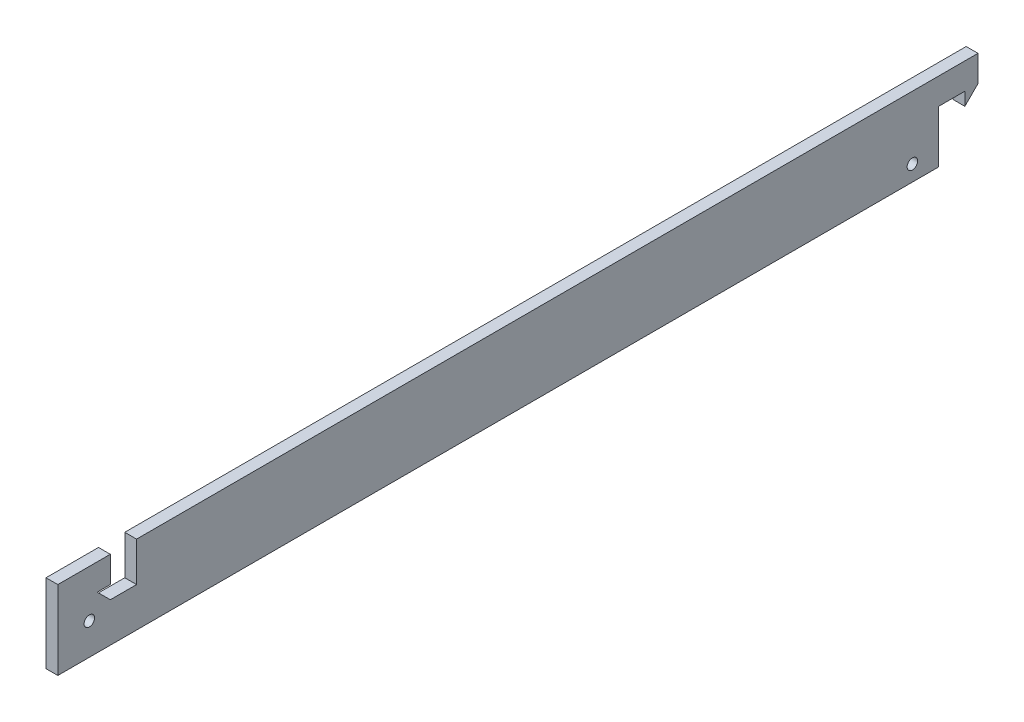
ISO-10303-21;
HEADER;
FILE_DESCRIPTION(('STEP AP214'),'2;1');
FILE_NAME('part.step','',(''),(''),'','','');
FILE_SCHEMA(('AUTOMOTIVE_DESIGN { 1 0 10303 214 1 1 1 1 }'));
ENDSEC;
DATA;
#1=APPLICATION_CONTEXT('core data for automotive mechanical design processes');
#2=APPLICATION_PROTOCOL_DEFINITION('international standard','automotive_design',2000,#1);
#3=PRODUCT_CONTEXT('',#1,'mechanical');
#4=PRODUCT('Part','Part','',(#3));
#5=PRODUCT_RELATED_PRODUCT_CATEGORY('part','',(#4));
#6=PRODUCT_DEFINITION_FORMATION('','',#4);
#7=PRODUCT_DEFINITION_CONTEXT('part definition',#1,'design');
#8=PRODUCT_DEFINITION('design','',#6,#7);
#9=PRODUCT_DEFINITION_SHAPE('','',#8);
#10=(LENGTH_UNIT() NAMED_UNIT(*) SI_UNIT(.MILLI.,.METRE.));
#11=(NAMED_UNIT(*) PLANE_ANGLE_UNIT() SI_UNIT($,.RADIAN.));
#12=(NAMED_UNIT(*) SI_UNIT($,.STERADIAN.) SOLID_ANGLE_UNIT());
#13=UNCERTAINTY_MEASURE_WITH_UNIT(LENGTH_MEASURE(1.E-05),#10,'distance_accuracy_value','');
#14=(GEOMETRIC_REPRESENTATION_CONTEXT(3) GLOBAL_UNCERTAINTY_ASSIGNED_CONTEXT((#13)) GLOBAL_UNIT_ASSIGNED_CONTEXT((#10,
#11,#12)) REPRESENTATION_CONTEXT('',''));
#15=CARTESIAN_POINT('',(0.,0.,0.));
#16=DIRECTION('',(0.,0.,1.));
#17=DIRECTION('',(1.,0.,0.));
#18=AXIS2_PLACEMENT_3D('',#15,#16,#17);
#19=CARTESIAN_POINT('',(4.5,0.,0.));
#20=DIRECTION('',(-1.,0.,0.));
#21=DIRECTION('',(0.,0.,1.));
#22=AXIS2_PLACEMENT_3D('',#19,#20,#21);
#23=PLANE('',#22);
#24=DIRECTION('',(0.,-1.,0.));
#25=VECTOR('',#24,1.);
#26=CARTESIAN_POINT('',(4.5,15.,30.8460387102848));
#27=LINE('',#26,#25);
#28=CARTESIAN_POINT('',(4.5,15.,30.8460387102848));
#29=VERTEX_POINT('',#28);
#30=CARTESIAN_POINT('',(4.5,0.,30.8460387102848));
#31=VERTEX_POINT('',#30);
#32=EDGE_CURVE('E199',#29,#31,#27,.T.);
#33=ORIENTED_EDGE('',*,*,#32,.T.);
#34=DIRECTION('',(0.,0.,1.));
#35=VECTOR('',#34,1.);
#36=CARTESIAN_POINT('',(4.5,0.,30.8460387102848));
#37=LINE('',#36,#35);
#38=CARTESIAN_POINT('',(4.5,0.,40.8460387102848));
#39=VERTEX_POINT('',#38);
#40=EDGE_CURVE('E113',#31,#39,#37,.T.);
#41=ORIENTED_EDGE('',*,*,#40,.T.);
#42=DIRECTION('',(0.,0.707106781186547,0.707106781186548));
#43=VECTOR('',#42,1.);
#44=CARTESIAN_POINT('',(4.5,0.,40.8460387102848));
#45=LINE('',#44,#43);
#46=CARTESIAN_POINT('',(4.5,5.,45.8460387102848));
#47=VERTEX_POINT('',#46);
#48=EDGE_CURVE('E232',#39,#47,#45,.T.);
#49=ORIENTED_EDGE('',*,*,#48,.T.);
#50=DIRECTION('',(0.,0.,-1.));
#51=VECTOR('',#50,1.);
#52=CARTESIAN_POINT('',(4.5,5.,45.8460387102848));
#53=LINE('',#52,#51);
#54=CARTESIAN_POINT('',(4.5,5.,40.8460387102848));
#55=VERTEX_POINT('',#54);
#56=EDGE_CURVE('E249',#47,#55,#53,.T.);
#57=ORIENTED_EDGE('',*,*,#56,.T.);
#58=DIRECTION('',(0.,1.,0.));
#59=VECTOR('',#58,1.);
#60=CARTESIAN_POINT('',(4.5,5.,40.8460387102848));
#61=LINE('',#60,#59);
#62=CARTESIAN_POINT('',(4.5,15.,40.8460387102848));
#63=VERTEX_POINT('',#62);
#64=EDGE_CURVE('E246',#55,#63,#61,.T.);
#65=ORIENTED_EDGE('',*,*,#64,.T.);
#66=DIRECTION('',(0.,0.,1.));
#67=VECTOR('',#66,1.);
#68=CARTESIAN_POINT('',(4.5,15.,40.8460387102848));
#69=LINE('',#68,#67);
#70=CARTESIAN_POINT('',(4.5,15.,60.8460387102848));
#71=VERTEX_POINT('',#70);
#72=EDGE_CURVE('E248',#63,#71,#69,.T.);
#73=ORIENTED_EDGE('',*,*,#72,.T.);
#74=DIRECTION('',(0.,-1.,0.));
#75=VECTOR('',#74,1.);
#76=CARTESIAN_POINT('',(4.5,15.,60.8460387102848));
#77=LINE('',#76,#75);
#78=CARTESIAN_POINT('',(4.5,-15.,60.8460387102848));
#79=VERTEX_POINT('',#78);
#80=EDGE_CURVE('E251',#71,#79,#77,.T.);
#81=ORIENTED_EDGE('',*,*,#80,.T.);
#82=DIRECTION('',(0.,0.,-1.));
#83=VECTOR('',#82,1.);
#84=CARTESIAN_POINT('',(4.5,-15.,60.8460387102848));
#85=LINE('',#84,#83);
#86=CARTESIAN_POINT('',(4.5,-15.,-274.653961289715));
#87=VERTEX_POINT('',#86);
#88=EDGE_CURVE('E257',#79,#87,#85,.T.);
#89=ORIENTED_EDGE('',*,*,#88,.T.);
#90=DIRECTION('',(0.,1.,0.));
#91=VECTOR('',#90,1.);
#92=CARTESIAN_POINT('',(4.5,-15.,-274.653961289715));
#93=LINE('',#92,#91);
#94=CARTESIAN_POINT('',(4.5,5.00000000000004,-274.653961289715));
#95=VERTEX_POINT('',#94);
#96=EDGE_CURVE('E259',#87,#95,#93,.T.);
#97=ORIENTED_EDGE('',*,*,#96,.T.);
#98=DIRECTION('',(0.,0.,-1.));
#99=VECTOR('',#98,1.);
#100=CARTESIAN_POINT('',(4.5,5.00000000000004,-274.653961289715));
#101=LINE('',#100,#99);
#102=CARTESIAN_POINT('',(4.5,5.00000000000004,-284.653961289715));
#103=VERTEX_POINT('',#102);
#104=EDGE_CURVE('E261',#95,#103,#101,.T.);
#105=ORIENTED_EDGE('',*,*,#104,.T.);
#106=DIRECTION('',(0.,-1.,0.));
#107=VECTOR('',#106,1.);
#108=CARTESIAN_POINT('',(4.5,5.00000000000004,-284.653961289715));
#109=LINE('',#108,#107);
#110=CARTESIAN_POINT('',(4.5,0.,-284.653961289715));
#111=VERTEX_POINT('',#110);
#112=EDGE_CURVE('E151',#103,#111,#109,.T.);
#113=ORIENTED_EDGE('',*,*,#112,.T.);
#114=DIRECTION('',(0.,0.707106781186547,-0.707106781186548));
#115=VECTOR('',#114,1.);
#116=CARTESIAN_POINT('',(4.5,0.,-284.653961289715));
#117=LINE('',#116,#115);
#118=CARTESIAN_POINT('',(4.5,5.00000000000004,-289.653961289715));
#119=VERTEX_POINT('',#118);
#120=EDGE_CURVE('E144',#111,#119,#117,.T.);
#121=ORIENTED_EDGE('',*,*,#120,.T.);
#122=DIRECTION('',(0.,1.,0.));
#123=VECTOR('',#122,1.);
#124=CARTESIAN_POINT('',(4.5,5.00000000000004,-289.653961289715));
#125=LINE('',#124,#123);
#126=CARTESIAN_POINT('',(4.5,15.,-289.653961289715));
#127=VERTEX_POINT('',#126);
#128=EDGE_CURVE('E148',#119,#127,#125,.T.);
#129=ORIENTED_EDGE('',*,*,#128,.T.);
#130=DIRECTION('',(0.,0.,1.));
#131=VECTOR('',#130,1.);
#132=CARTESIAN_POINT('',(4.5,15.,-289.653961289715));
#133=LINE('',#132,#131);
#134=EDGE_CURVE('E54',#127,#29,#133,.T.);
#135=ORIENTED_EDGE('',*,*,#134,.T.);
#136=EDGE_LOOP('',(#33,#41,#49,#57,#65,#73,#81,#89,#97,#105,#113,#121,#129,#135));
#137=FACE_BOUND('',#136,.T.);
#138=CARTESIAN_POINT('',(4.5,-3.00000000000003,48.8460387102848));
#139=DIRECTION('',(1.,0.,0.));
#140=DIRECTION('',(0.,0.,-1.));
#141=AXIS2_PLACEMENT_3D('',#138,#139,#140);
#142=CIRCLE('',#141,2.);
#143=CARTESIAN_POINT('',(4.5,-3.00000000000003,46.8460387102848));
#144=VERTEX_POINT('',#143);
#145=EDGE_CURVE('E175',#144,#144,#142,.T.);
#146=ORIENTED_EDGE('',*,*,#145,.F.);
#147=EDGE_LOOP('',(#146));
#148=FACE_BOUND('',#147,.T.);
#149=CARTESIAN_POINT('',(4.5,-9.00000000000037,-264.653961289715));
#150=DIRECTION('',(1.,0.,0.));
#151=DIRECTION('',(0.,0.,-1.));
#152=AXIS2_PLACEMENT_3D('',#149,#150,#151);
#153=CIRCLE('',#152,2.00000000019509);
#154=CARTESIAN_POINT('',(4.5,-9.00000000000037,-266.65396128991));
#155=VERTEX_POINT('',#154);
#156=EDGE_CURVE('E282',#155,#155,#153,.T.);
#157=ORIENTED_EDGE('',*,*,#156,.F.);
#158=EDGE_LOOP('',(#157));
#159=FACE_BOUND('',#158,.T.);
#160=ADVANCED_FACE('F37',(#137,#148,#159),#23,.F.);
#161=CARTESIAN_POINT('',(0.,0.,0.));
#162=DIRECTION('',(-1.,0.,0.));
#163=DIRECTION('',(0.,0.,1.));
#164=AXIS2_PLACEMENT_3D('',#161,#162,#163);
#165=PLANE('',#164);
#166=CARTESIAN_POINT('',(0.,-3.00000000000003,48.8460387102848));
#167=DIRECTION('',(1.,0.,0.));
#168=DIRECTION('',(0.,0.,-1.));
#169=AXIS2_PLACEMENT_3D('',#166,#167,#168);
#170=CIRCLE('',#169,2.);
#171=CARTESIAN_POINT('',(0.,-3.00000000000003,46.8460387102848));
#172=VERTEX_POINT('',#171);
#173=EDGE_CURVE('E279',#172,#172,#170,.T.);
#174=ORIENTED_EDGE('',*,*,#173,.T.);
#175=EDGE_LOOP('',(#174));
#176=FACE_BOUND('',#175,.T.);
#177=DIRECTION('',(0.,-1.,0.));
#178=VECTOR('',#177,1.);
#179=CARTESIAN_POINT('',(0.,15.,30.8460387102848));
#180=LINE('',#179,#178);
#181=CARTESIAN_POINT('',(0.,15.,30.8460387102848));
#182=VERTEX_POINT('',#181);
#183=CARTESIAN_POINT('',(0.,0.,30.8460387102848));
#184=VERTEX_POINT('',#183);
#185=EDGE_CURVE('E171',#182,#184,#180,.T.);
#186=ORIENTED_EDGE('',*,*,#185,.F.);
#187=DIRECTION('',(0.,0.,1.));
#188=VECTOR('',#187,1.);
#189=CARTESIAN_POINT('',(0.,15.,-274.653961289715));
#190=LINE('',#189,#188);
#191=CARTESIAN_POINT('',(0.,15.,-289.653961289715));
#192=VERTEX_POINT('',#191);
#193=EDGE_CURVE('E101',#192,#182,#190,.T.);
#194=ORIENTED_EDGE('',*,*,#193,.F.);
#195=DIRECTION('',(0.,1.,0.));
#196=VECTOR('',#195,1.);
#197=CARTESIAN_POINT('',(0.,5.00000000000004,-289.653961289715));
#198=LINE('',#197,#196);
#199=CARTESIAN_POINT('',(0.,5.00000000000004,-289.653961289715));
#200=VERTEX_POINT('',#199);
#201=EDGE_CURVE('E196',#200,#192,#198,.T.);
#202=ORIENTED_EDGE('',*,*,#201,.F.);
#203=DIRECTION('',(0.,0.707106781186547,-0.707106781186548));
#204=VECTOR('',#203,1.);
#205=CARTESIAN_POINT('',(0.,0.,-284.653961289715));
#206=LINE('',#205,#204);
#207=CARTESIAN_POINT('',(0.,0.,-284.653961289715));
#208=VERTEX_POINT('',#207);
#209=EDGE_CURVE('E160',#208,#200,#206,.T.);
#210=ORIENTED_EDGE('',*,*,#209,.F.);
#211=DIRECTION('',(0.,-1.,0.));
#212=VECTOR('',#211,1.);
#213=CARTESIAN_POINT('',(0.,5.00000000000004,-284.653961289715));
#214=LINE('',#213,#212);
#215=CARTESIAN_POINT('',(0.,5.00000000000004,-284.653961289715));
#216=VERTEX_POINT('',#215);
#217=EDGE_CURVE('E193',#216,#208,#214,.T.);
#218=ORIENTED_EDGE('',*,*,#217,.F.);
#219=DIRECTION('',(0.,0.,-1.));
#220=VECTOR('',#219,1.);
#221=CARTESIAN_POINT('',(0.,5.00000000000004,-274.653961289715));
#222=LINE('',#221,#220);
#223=CARTESIAN_POINT('',(0.,5.00000000000004,-274.653961289715));
#224=VERTEX_POINT('',#223);
#225=EDGE_CURVE('E191',#224,#216,#222,.T.);
#226=ORIENTED_EDGE('',*,*,#225,.F.);
#227=DIRECTION('',(0.,1.,0.));
#228=VECTOR('',#227,1.);
#229=CARTESIAN_POINT('',(0.,-15.,-274.653961289715));
#230=LINE('',#229,#228);
#231=CARTESIAN_POINT('',(0.,-15.,-274.653961289715));
#232=VERTEX_POINT('',#231);
#233=EDGE_CURVE('E189',#232,#224,#230,.T.);
#234=ORIENTED_EDGE('',*,*,#233,.F.);
#235=DIRECTION('',(0.,0.,-1.));
#236=VECTOR('',#235,1.);
#237=CARTESIAN_POINT('',(0.,-15.,60.8460387102848));
#238=LINE('',#237,#236);
#239=CARTESIAN_POINT('',(0.,-15.,60.8460387102848));
#240=VERTEX_POINT('',#239);
#241=EDGE_CURVE('E187',#240,#232,#238,.T.);
#242=ORIENTED_EDGE('',*,*,#241,.F.);
#243=DIRECTION('',(0.,-1.,0.));
#244=VECTOR('',#243,1.);
#245=CARTESIAN_POINT('',(0.,15.,60.8460387102848));
#246=LINE('',#245,#244);
#247=CARTESIAN_POINT('',(0.,15.,60.8460387102848));
#248=VERTEX_POINT('',#247);
#249=EDGE_CURVE('E185',#248,#240,#246,.T.);
#250=ORIENTED_EDGE('',*,*,#249,.F.);
#251=DIRECTION('',(0.,0.,1.));
#252=VECTOR('',#251,1.);
#253=CARTESIAN_POINT('',(0.,15.,40.8460387102848));
#254=LINE('',#253,#252);
#255=CARTESIAN_POINT('',(0.,15.,40.8460387102848));
#256=VERTEX_POINT('',#255);
#257=EDGE_CURVE('E183',#256,#248,#254,.T.);
#258=ORIENTED_EDGE('',*,*,#257,.F.);
#259=DIRECTION('',(0.,1.,0.));
#260=VECTOR('',#259,1.);
#261=CARTESIAN_POINT('',(0.,5.,40.8460387102848));
#262=LINE('',#261,#260);
#263=CARTESIAN_POINT('',(0.,5.,40.8460387102848));
#264=VERTEX_POINT('',#263);
#265=EDGE_CURVE('E181',#264,#256,#262,.T.);
#266=ORIENTED_EDGE('',*,*,#265,.F.);
#267=DIRECTION('',(0.,0.,-1.));
#268=VECTOR('',#267,1.);
#269=CARTESIAN_POINT('',(0.,5.,45.8460387102848));
#270=LINE('',#269,#268);
#271=CARTESIAN_POINT('',(0.,5.,45.8460387102848));
#272=VERTEX_POINT('',#271);
#273=EDGE_CURVE('E179',#272,#264,#270,.T.);
#274=ORIENTED_EDGE('',*,*,#273,.F.);
#275=DIRECTION('',(0.,0.707106781186547,0.707106781186548));
#276=VECTOR('',#275,1.);
#277=CARTESIAN_POINT('',(0.,0.,40.8460387102848));
#278=LINE('',#277,#276);
#279=CARTESIAN_POINT('',(0.,0.,40.8460387102848));
#280=VERTEX_POINT('',#279);
#281=EDGE_CURVE('E177',#280,#272,#278,.T.);
#282=ORIENTED_EDGE('',*,*,#281,.F.);
#283=DIRECTION('',(0.,0.,1.));
#284=VECTOR('',#283,1.);
#285=CARTESIAN_POINT('',(0.,0.,30.8460387102848));
#286=LINE('',#285,#284);
#287=EDGE_CURVE('E174',#184,#280,#286,.T.);
#288=ORIENTED_EDGE('',*,*,#287,.F.);
#289=EDGE_LOOP('',(#186,#194,#202,#210,#218,#226,#234,#242,#250,#258,#266,#274,#282,#288));
#290=FACE_BOUND('',#289,.T.);
#291=CARTESIAN_POINT('',(0.,-9.00000000000037,-264.653961289715));
#292=DIRECTION('',(1.,0.,0.));
#293=DIRECTION('',(0.,0.,-1.));
#294=AXIS2_PLACEMENT_3D('',#291,#292,#293);
#295=CIRCLE('',#294,2.00000000019509);
#296=CARTESIAN_POINT('',(0.,-9.00000000000037,-266.65396128991));
#297=VERTEX_POINT('',#296);
#298=EDGE_CURVE('E285',#297,#297,#295,.T.);
#299=ORIENTED_EDGE('',*,*,#298,.T.);
#300=EDGE_LOOP('',(#299));
#301=FACE_BOUND('',#300,.T.);
#302=ADVANCED_FACE('F234',(#176,#290,#301),#165,.T.);
#303=CARTESIAN_POINT('',(4.5,15.,30.8460387102848));
#304=DIRECTION('',(0.,0.,-1.));
#305=DIRECTION('',(-1.,0.,0.));
#306=AXIS2_PLACEMENT_3D('',#303,#304,#305);
#307=PLANE('',#306);
#308=ORIENTED_EDGE('',*,*,#185,.T.);
#309=DIRECTION('',(-1.,0.,0.));
#310=VECTOR('',#309,1.);
#311=CARTESIAN_POINT('',(4.5,0.,30.8460387102848));
#312=LINE('',#311,#310);
#313=EDGE_CURVE('E11',#31,#184,#312,.T.);
#314=ORIENTED_EDGE('',*,*,#313,.F.);
#315=ORIENTED_EDGE('',*,*,#32,.F.);
#316=DIRECTION('',(-1.,0.,0.));
#317=VECTOR('',#316,1.);
#318=CARTESIAN_POINT('',(4.5,15.,30.8460387102848));
#319=LINE('',#318,#317);
#320=EDGE_CURVE('E167',#29,#182,#319,.T.);
#321=ORIENTED_EDGE('',*,*,#320,.T.);
#322=EDGE_LOOP('',(#308,#314,#315,#321));
#323=FACE_BOUND('',#322,.T.);
#324=ADVANCED_FACE('F39',(#323),#307,.F.);
#325=CARTESIAN_POINT('',(4.5,0.,30.8460387102848));
#326=DIRECTION('',(0.,-1.,0.));
#327=DIRECTION('',(0.,0.,-1.));
#328=AXIS2_PLACEMENT_3D('',#325,#326,#327);
#329=PLANE('',#328);
#330=ORIENTED_EDGE('',*,*,#287,.T.);
#331=DIRECTION('',(-1.,0.,0.));
#332=VECTOR('',#331,1.);
#333=CARTESIAN_POINT('',(4.5,0.,40.8460387102848));
#334=LINE('',#333,#332);
#335=EDGE_CURVE('E46',#39,#280,#334,.T.);
#336=ORIENTED_EDGE('',*,*,#335,.F.);
#337=ORIENTED_EDGE('',*,*,#40,.F.);
#338=ORIENTED_EDGE('',*,*,#313,.T.);
#339=EDGE_LOOP('',(#330,#336,#337,#338));
#340=FACE_BOUND('',#339,.T.);
#341=ADVANCED_FACE('F336',(#340),#329,.F.);
#342=CARTESIAN_POINT('',(4.5,0.,40.8460387102848));
#343=DIRECTION('',(0.,-0.707106781186548,0.707106781186547));
#344=DIRECTION('',(0.,-0.707106781186547,-0.707106781186548));
#345=AXIS2_PLACEMENT_3D('',#342,#343,#344);
#346=PLANE('',#345);
#347=ORIENTED_EDGE('',*,*,#281,.T.);
#348=DIRECTION('',(-1.,0.,0.));
#349=VECTOR('',#348,1.);
#350=CARTESIAN_POINT('',(4.5,5.,45.8460387102848));
#351=LINE('',#350,#349);
#352=EDGE_CURVE('E224',#47,#272,#351,.T.);
#353=ORIENTED_EDGE('',*,*,#352,.F.);
#354=ORIENTED_EDGE('',*,*,#48,.F.);
#355=ORIENTED_EDGE('',*,*,#335,.T.);
#356=EDGE_LOOP('',(#347,#353,#354,#355));
#357=FACE_BOUND('',#356,.T.);
#358=ADVANCED_FACE('F230',(#357),#346,.F.);
#359=CARTESIAN_POINT('',(4.5,5.,45.8460387102848));
#360=DIRECTION('',(0.,1.,0.));
#361=DIRECTION('',(0.,0.,1.));
#362=AXIS2_PLACEMENT_3D('',#359,#360,#361);
#363=PLANE('',#362);
#364=ORIENTED_EDGE('',*,*,#273,.T.);
#365=DIRECTION('',(-1.,0.,0.));
#366=VECTOR('',#365,1.);
#367=CARTESIAN_POINT('',(4.5,5.,40.8460387102848));
#368=LINE('',#367,#366);
#369=EDGE_CURVE('E221',#55,#264,#368,.T.);
#370=ORIENTED_EDGE('',*,*,#369,.F.);
#371=ORIENTED_EDGE('',*,*,#56,.F.);
#372=ORIENTED_EDGE('',*,*,#352,.T.);
#373=EDGE_LOOP('',(#364,#370,#371,#372));
#374=FACE_BOUND('',#373,.T.);
#375=ADVANCED_FACE('F240',(#374),#363,.F.);
#376=CARTESIAN_POINT('',(4.5,5.,40.8460387102848));
#377=DIRECTION('',(0.,0.,1.));
#378=DIRECTION('',(1.,0.,0.));
#379=AXIS2_PLACEMENT_3D('',#376,#377,#378);
#380=PLANE('',#379);
#381=ORIENTED_EDGE('',*,*,#265,.T.);
#382=DIRECTION('',(-1.,0.,0.));
#383=VECTOR('',#382,1.);
#384=CARTESIAN_POINT('',(4.5,15.,40.8460387102848));
#385=LINE('',#384,#383);
#386=EDGE_CURVE('E218',#63,#256,#385,.T.);
#387=ORIENTED_EDGE('',*,*,#386,.F.);
#388=ORIENTED_EDGE('',*,*,#64,.F.);
#389=ORIENTED_EDGE('',*,*,#369,.T.);
#390=EDGE_LOOP('',(#381,#387,#388,#389));
#391=FACE_BOUND('',#390,.T.);
#392=ADVANCED_FACE('F244',(#391),#380,.F.);
#393=CARTESIAN_POINT('',(4.5,15.,40.8460387102848));
#394=DIRECTION('',(0.,-1.,0.));
#395=DIRECTION('',(0.,0.,-1.));
#396=AXIS2_PLACEMENT_3D('',#393,#394,#395);
#397=PLANE('',#396);
#398=ORIENTED_EDGE('',*,*,#257,.T.);
#399=DIRECTION('',(-1.,0.,0.));
#400=VECTOR('',#399,1.);
#401=CARTESIAN_POINT('',(4.5,15.,60.8460387102848));
#402=LINE('',#401,#400);
#403=EDGE_CURVE('E215',#71,#248,#402,.T.);
#404=ORIENTED_EDGE('',*,*,#403,.F.);
#405=ORIENTED_EDGE('',*,*,#72,.F.);
#406=ORIENTED_EDGE('',*,*,#386,.T.);
#407=EDGE_LOOP('',(#398,#404,#405,#406));
#408=FACE_BOUND('',#407,.T.);
#409=ADVANCED_FACE('F326',(#408),#397,.F.);
#410=CARTESIAN_POINT('',(4.5,15.,60.8460387102848));
#411=DIRECTION('',(0.,0.,-1.));
#412=DIRECTION('',(-1.,0.,0.));
#413=AXIS2_PLACEMENT_3D('',#410,#411,#412);
#414=PLANE('',#413);
#415=ORIENTED_EDGE('',*,*,#249,.T.);
#416=DIRECTION('',(-1.,0.,0.));
#417=VECTOR('',#416,1.);
#418=CARTESIAN_POINT('',(4.5,-15.,60.8460387102848));
#419=LINE('',#418,#417);
#420=EDGE_CURVE('E212',#79,#240,#419,.T.);
#421=ORIENTED_EDGE('',*,*,#420,.F.);
#422=ORIENTED_EDGE('',*,*,#80,.F.);
#423=ORIENTED_EDGE('',*,*,#403,.T.);
#424=EDGE_LOOP('',(#415,#421,#422,#423));
#425=FACE_BOUND('',#424,.T.);
#426=ADVANCED_FACE('F322',(#425),#414,.F.);
#427=CARTESIAN_POINT('',(4.5,-15.,60.8460387102848));
#428=DIRECTION('',(0.,1.,0.));
#429=DIRECTION('',(0.,0.,1.));
#430=AXIS2_PLACEMENT_3D('',#427,#428,#429);
#431=PLANE('',#430);
#432=ORIENTED_EDGE('',*,*,#241,.T.);
#433=DIRECTION('',(-1.,0.,0.));
#434=VECTOR('',#433,1.);
#435=CARTESIAN_POINT('',(4.5,-15.,-274.653961289715));
#436=LINE('',#435,#434);
#437=EDGE_CURVE('E209',#87,#232,#436,.T.);
#438=ORIENTED_EDGE('',*,*,#437,.F.);
#439=ORIENTED_EDGE('',*,*,#88,.F.);
#440=ORIENTED_EDGE('',*,*,#420,.T.);
#441=EDGE_LOOP('',(#432,#438,#439,#440));
#442=FACE_BOUND('',#441,.T.);
#443=ADVANCED_FACE('F318',(#442),#431,.F.);
#444=CARTESIAN_POINT('',(4.5,-15.,-274.653961289715));
#445=DIRECTION('',(0.,0.,1.));
#446=DIRECTION('',(1.,0.,0.));
#447=AXIS2_PLACEMENT_3D('',#444,#445,#446);
#448=PLANE('',#447);
#449=ORIENTED_EDGE('',*,*,#233,.T.);
#450=DIRECTION('',(-1.,0.,0.));
#451=VECTOR('',#450,1.);
#452=CARTESIAN_POINT('',(4.5,5.00000000000004,-274.653961289715));
#453=LINE('',#452,#451);
#454=EDGE_CURVE('E206',#95,#224,#453,.T.);
#455=ORIENTED_EDGE('',*,*,#454,.F.);
#456=ORIENTED_EDGE('',*,*,#96,.F.);
#457=ORIENTED_EDGE('',*,*,#437,.T.);
#458=EDGE_LOOP('',(#449,#455,#456,#457));
#459=FACE_BOUND('',#458,.T.);
#460=ADVANCED_FACE('F315',(#459),#448,.F.);
#461=CARTESIAN_POINT('',(4.5,5.00000000000004,-274.653961289715));
#462=DIRECTION('',(0.,1.,0.));
#463=DIRECTION('',(0.,0.,1.));
#464=AXIS2_PLACEMENT_3D('',#461,#462,#463);
#465=PLANE('',#464);
#466=ORIENTED_EDGE('',*,*,#225,.T.);
#467=DIRECTION('',(-1.,0.,0.));
#468=VECTOR('',#467,1.);
#469=CARTESIAN_POINT('',(4.5,5.00000000000004,-284.653961289715));
#470=LINE('',#469,#468);
#471=EDGE_CURVE('E203',#103,#216,#470,.T.);
#472=ORIENTED_EDGE('',*,*,#471,.F.);
#473=ORIENTED_EDGE('',*,*,#104,.F.);
#474=ORIENTED_EDGE('',*,*,#454,.T.);
#475=EDGE_LOOP('',(#466,#472,#473,#474));
#476=FACE_BOUND('',#475,.T.);
#477=ADVANCED_FACE('F267',(#476),#465,.F.);
#478=CARTESIAN_POINT('',(4.5,5.00000000000004,-284.653961289715));
#479=DIRECTION('',(0.,0.,-1.));
#480=DIRECTION('',(-1.,0.,0.));
#481=AXIS2_PLACEMENT_3D('',#478,#479,#480);
#482=PLANE('',#481);
#483=ORIENTED_EDGE('',*,*,#217,.T.);
#484=DIRECTION('',(-1.,0.,0.));
#485=VECTOR('',#484,1.);
#486=CARTESIAN_POINT('',(4.5,0.,-284.653961289715));
#487=LINE('',#486,#485);
#488=EDGE_CURVE('E162',#111,#208,#487,.T.);
#489=ORIENTED_EDGE('',*,*,#488,.F.);
#490=ORIENTED_EDGE('',*,*,#112,.F.);
#491=ORIENTED_EDGE('',*,*,#471,.T.);
#492=EDGE_LOOP('',(#483,#489,#490,#491));
#493=FACE_BOUND('',#492,.T.);
#494=ADVANCED_FACE('F271',(#493),#482,.F.);
#495=CARTESIAN_POINT('',(4.5,0.,-284.653961289715));
#496=DIRECTION('',(0.,0.707106781186548,0.707106781186547));
#497=DIRECTION('',(0.,-0.707106781186547,0.707106781186548));
#498=AXIS2_PLACEMENT_3D('',#495,#496,#497);
#499=PLANE('',#498);
#500=ORIENTED_EDGE('',*,*,#209,.T.);
#501=DIRECTION('',(-1.,0.,0.));
#502=VECTOR('',#501,1.);
#503=CARTESIAN_POINT('',(4.5,5.00000000000004,-289.653961289715));
#504=LINE('',#503,#502);
#505=EDGE_CURVE('E157',#119,#200,#504,.T.);
#506=ORIENTED_EDGE('',*,*,#505,.F.);
#507=ORIENTED_EDGE('',*,*,#120,.F.);
#508=ORIENTED_EDGE('',*,*,#488,.T.);
#509=EDGE_LOOP('',(#500,#506,#507,#508));
#510=FACE_BOUND('',#509,.T.);
#511=ADVANCED_FACE('F158',(#510),#499,.F.);
#512=CARTESIAN_POINT('',(4.5,5.00000000000004,-289.653961289715));
#513=DIRECTION('',(0.,0.,1.));
#514=DIRECTION('',(1.,0.,0.));
#515=AXIS2_PLACEMENT_3D('',#512,#513,#514);
#516=PLANE('',#515);
#517=ORIENTED_EDGE('',*,*,#201,.T.);
#518=DIRECTION('',(-1.,0.,0.));
#519=VECTOR('',#518,1.);
#520=CARTESIAN_POINT('',(4.5,15.,-289.653961289715));
#521=LINE('',#520,#519);
#522=EDGE_CURVE('E163',#127,#192,#521,.T.);
#523=ORIENTED_EDGE('',*,*,#522,.F.);
#524=ORIENTED_EDGE('',*,*,#128,.F.);
#525=ORIENTED_EDGE('',*,*,#505,.T.);
#526=EDGE_LOOP('',(#517,#523,#524,#525));
#527=FACE_BOUND('',#526,.T.);
#528=ADVANCED_FACE('F165',(#527),#516,.F.);
#529=CARTESIAN_POINT('',(4.5,15.,-274.653961289715));
#530=DIRECTION('',(0.,-1.,0.));
#531=DIRECTION('',(0.,0.,-1.));
#532=AXIS2_PLACEMENT_3D('',#529,#530,#531);
#533=PLANE('',#532);
#534=ORIENTED_EDGE('',*,*,#193,.T.);
#535=ORIENTED_EDGE('',*,*,#320,.F.);
#536=ORIENTED_EDGE('',*,*,#134,.F.);
#537=ORIENTED_EDGE('',*,*,#522,.T.);
#538=EDGE_LOOP('',(#534,#535,#536,#537));
#539=FACE_BOUND('',#538,.T.);
#540=ADVANCED_FACE('F272',(#539),#533,.F.);
#541=CARTESIAN_POINT('',(4.5,-3.00000000000003,48.8460387102848));
#542=DIRECTION('',(-1.,0.,0.));
#543=DIRECTION('',(0.,0.,1.));
#544=AXIS2_PLACEMENT_3D('',#541,#542,#543);
#545=CYLINDRICAL_SURFACE('',#544,2.);
#546=ORIENTED_EDGE('',*,*,#145,.T.);
#547=EDGE_LOOP('',(#546));
#548=FACE_BOUND('',#547,.T.);
#549=ORIENTED_EDGE('',*,*,#173,.F.);
#550=EDGE_LOOP('',(#549));
#551=FACE_BOUND('',#550,.T.);
#552=ADVANCED_FACE('F302',(#548,#551),#545,.F.);
#553=CARTESIAN_POINT('',(4.5,-9.00000000000037,-264.653961289715));
#554=DIRECTION('',(-1.,0.,0.));
#555=DIRECTION('',(0.,0.,1.));
#556=AXIS2_PLACEMENT_3D('',#553,#554,#555);
#557=CYLINDRICAL_SURFACE('',#556,2.00000000019509);
#558=ORIENTED_EDGE('',*,*,#156,.T.);
#559=EDGE_LOOP('',(#558));
#560=FACE_BOUND('',#559,.T.);
#561=ORIENTED_EDGE('',*,*,#298,.F.);
#562=EDGE_LOOP('',(#561));
#563=FACE_BOUND('',#562,.T.);
#564=ADVANCED_FACE('F291',(#560,#563),#557,.F.);
#565=CLOSED_SHELL('',(#160,#302,#324,#341,#358,#375,#392,#409,#426,#443,#460,#477,#494,#511,
#528,#540,#552,#564));
#566=MANIFOLD_SOLID_BREP('B2',#565);
#567=ADVANCED_BREP_SHAPE_REPRESENTATION('',(#18,#566),#14);
#568=SHAPE_DEFINITION_REPRESENTATION(#9,#567);
ENDSEC;
END-ISO-10303-21;
